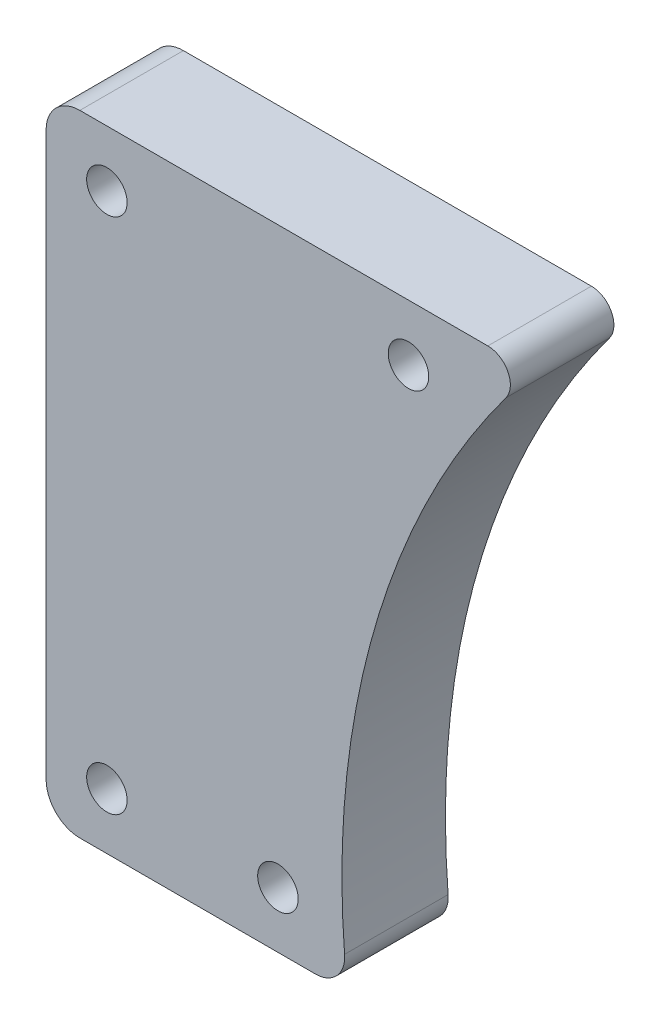
ISO-10303-21;
HEADER;
FILE_DESCRIPTION(('STEP AP214'),'2;1');
FILE_NAME('part.step','',(''),(''),'','','');
FILE_SCHEMA(('AUTOMOTIVE_DESIGN { 1 0 10303 214 1 1 1 1 }'));
ENDSEC;
DATA;
#1=APPLICATION_CONTEXT('core data for automotive mechanical design processes');
#2=APPLICATION_PROTOCOL_DEFINITION('international standard','automotive_design',2000,#1);
#3=PRODUCT_CONTEXT('',#1,'mechanical');
#4=PRODUCT('Part','Part','',(#3));
#5=PRODUCT_RELATED_PRODUCT_CATEGORY('part','',(#4));
#6=PRODUCT_DEFINITION_FORMATION('','',#4);
#7=PRODUCT_DEFINITION_CONTEXT('part definition',#1,'design');
#8=PRODUCT_DEFINITION('design','',#6,#7);
#9=PRODUCT_DEFINITION_SHAPE('','',#8);
#10=(LENGTH_UNIT() NAMED_UNIT(*) SI_UNIT(.MILLI.,.METRE.));
#11=(NAMED_UNIT(*) PLANE_ANGLE_UNIT() SI_UNIT($,.RADIAN.));
#12=(NAMED_UNIT(*) SI_UNIT($,.STERADIAN.) SOLID_ANGLE_UNIT());
#13=UNCERTAINTY_MEASURE_WITH_UNIT(LENGTH_MEASURE(1.E-05),#10,'distance_accuracy_value','');
#14=(GEOMETRIC_REPRESENTATION_CONTEXT(3) GLOBAL_UNCERTAINTY_ASSIGNED_CONTEXT((#13)) GLOBAL_UNIT_ASSIGNED_CONTEXT((#10,
#11,#12)) REPRESENTATION_CONTEXT('',''));
#15=CARTESIAN_POINT('',(0.,0.,0.));
#16=DIRECTION('',(0.,0.,1.));
#17=DIRECTION('',(1.,0.,0.));
#18=AXIS2_PLACEMENT_3D('',#15,#16,#17);
#19=CARTESIAN_POINT('',(99.822,0.,159.258));
#20=DIRECTION('',(0.,0.,-1.));
#21=DIRECTION('',(1.,0.,0.));
#22=AXIS2_PLACEMENT_3D('',#19,#20,#21);
#23=CYLINDRICAL_SURFACE('',#22,46.99);
#24=CARTESIAN_POINT('',(99.822,0.,159.258));
#25=DIRECTION('',(0.,0.,1.));
#26=DIRECTION('',(-1.,0.,0.));
#27=AXIS2_PLACEMENT_3D('',#24,#25,#26);
#28=CIRCLE('',#27,46.99);
#29=CARTESIAN_POINT('',(62.0869585035923,28.0022631811142,159.258));
#30=VERTEX_POINT('',#29);
#31=CARTESIAN_POINT('',(52.9817297942535,-3.74822452004331,159.258));
#32=VERTEX_POINT('',#31);
#33=EDGE_CURVE('E134',#30,#32,#28,.T.);
#34=ORIENTED_EDGE('',*,*,#33,.T.);
#35=DIRECTION('',(0.,0.,-1.));
#36=VECTOR('',#35,1.);
#37=CARTESIAN_POINT('',(52.9817297942535,-3.74822452004331,159.258));
#38=LINE('',#37,#36);
#39=CARTESIAN_POINT('',(52.9817297942535,-3.74822452004331,153.416));
#40=VERTEX_POINT('',#39);
#41=EDGE_CURVE('E155',#40,#32,#38,.F.);
#42=ORIENTED_EDGE('',*,*,#41,.F.);
#43=CARTESIAN_POINT('',(99.822,0.,153.416));
#44=DIRECTION('',(0.,0.,1.));
#45=DIRECTION('',(-1.,0.,0.));
#46=AXIS2_PLACEMENT_3D('',#43,#44,#45);
#47=CIRCLE('',#46,46.99);
#48=CARTESIAN_POINT('',(62.0869585035923,28.0022631811142,153.416));
#49=VERTEX_POINT('',#48);
#50=EDGE_CURVE('E136',#49,#40,#47,.T.);
#51=ORIENTED_EDGE('',*,*,#50,.F.);
#52=DIRECTION('',(0.,0.,-1.));
#53=VECTOR('',#52,1.);
#54=CARTESIAN_POINT('',(62.0869585035923,28.0022631811142,159.258));
#55=LINE('',#54,#53);
#56=EDGE_CURVE('E160',#30,#49,#55,.T.);
#57=ORIENTED_EDGE('',*,*,#56,.F.);
#58=EDGE_LOOP('',(#34,#42,#51,#57));
#59=FACE_BOUND('',#58,.T.);
#60=ADVANCED_FACE('F39',(#59),#23,.F.);
#61=CARTESIAN_POINT('',(36.1406413963146,-5.53091889507186,159.258));
#62=DIRECTION('',(0.,1.,0.));
#63=DIRECTION('',(1.,0.,0.));
#64=AXIS2_PLACEMENT_3D('',#61,#62,#63);
#65=PLANE('',#64);
#66=DIRECTION('',(-1.,0.,0.));
#67=VECTOR('',#66,1.);
#68=CARTESIAN_POINT('',(36.1406413963146,-5.53091889507186,159.258));
#69=LINE('',#68,#67);
#70=CARTESIAN_POINT('',(51.3359905708083,-5.53091889507186,159.258));
#71=VERTEX_POINT('',#70);
#72=CARTESIAN_POINT('',(38.0456413963146,-5.53091889507186,159.258));
#73=VERTEX_POINT('',#72);
#74=EDGE_CURVE('E184',#71,#73,#69,.T.);
#75=ORIENTED_EDGE('',*,*,#74,.T.);
#76=DIRECTION('',(0.,0.,-1.));
#77=VECTOR('',#76,1.);
#78=CARTESIAN_POINT('',(38.0456413963146,-5.53091889507186,159.258));
#79=LINE('',#78,#77);
#80=CARTESIAN_POINT('',(38.0456413963146,-5.53091889507186,153.416));
#81=VERTEX_POINT('',#80);
#82=EDGE_CURVE('E117',#81,#73,#79,.F.);
#83=ORIENTED_EDGE('',*,*,#82,.F.);
#84=DIRECTION('',(-1.,0.,0.));
#85=VECTOR('',#84,1.);
#86=CARTESIAN_POINT('',(36.1406413963146,-5.53091889507186,153.416));
#87=LINE('',#86,#85);
#88=CARTESIAN_POINT('',(51.3359905708083,-5.53091889507186,153.416));
#89=VERTEX_POINT('',#88);
#90=EDGE_CURVE('E113',#89,#81,#87,.T.);
#91=ORIENTED_EDGE('',*,*,#90,.F.);
#92=DIRECTION('',(0.,0.,-1.));
#93=VECTOR('',#92,1.);
#94=CARTESIAN_POINT('',(51.3359905708083,-5.53091889507186,159.258));
#95=LINE('',#94,#93);
#96=EDGE_CURVE('E150',#71,#89,#95,.T.);
#97=ORIENTED_EDGE('',*,*,#96,.F.);
#98=EDGE_LOOP('',(#75,#83,#91,#97));
#99=FACE_BOUND('',#98,.T.);
#100=ADVANCED_FACE('F222',(#99),#65,.F.);
#101=CARTESIAN_POINT('',(36.1406413963146,30.0290811049281,159.258));
#102=DIRECTION('',(1.,0.,0.));
#103=DIRECTION('',(0.,-1.,0.));
#104=AXIS2_PLACEMENT_3D('',#101,#102,#103);
#105=PLANE('',#104);
#106=DIRECTION('',(0.,1.,0.));
#107=VECTOR('',#106,1.);
#108=CARTESIAN_POINT('',(36.1406413963146,30.0290811049281,159.258));
#109=LINE('',#108,#107);
#110=CARTESIAN_POINT('',(36.1406413963146,-3.62591889507186,159.258));
#111=VERTEX_POINT('',#110);
#112=CARTESIAN_POINT('',(36.1406413963146,28.1240811049281,159.258));
#113=VERTEX_POINT('',#112);
#114=EDGE_CURVE('E182',#111,#113,#109,.T.);
#115=ORIENTED_EDGE('',*,*,#114,.T.);
#116=DIRECTION('',(0.,0.,-1.));
#117=VECTOR('',#116,1.);
#118=CARTESIAN_POINT('',(36.1406413963146,28.1240811049281,159.258));
#119=LINE('',#118,#117);
#120=CARTESIAN_POINT('',(36.1406413963146,28.1240811049281,153.416));
#121=VERTEX_POINT('',#120);
#122=EDGE_CURVE('E127',#121,#113,#119,.F.);
#123=ORIENTED_EDGE('',*,*,#122,.F.);
#124=DIRECTION('',(0.,1.,0.));
#125=VECTOR('',#124,1.);
#126=CARTESIAN_POINT('',(36.1406413963146,30.0290811049281,153.416));
#127=LINE('',#126,#125);
#128=CARTESIAN_POINT('',(36.1406413963146,-3.62591889507186,153.416));
#129=VERTEX_POINT('',#128);
#130=EDGE_CURVE('E110',#129,#121,#127,.T.);
#131=ORIENTED_EDGE('',*,*,#130,.F.);
#132=DIRECTION('',(0.,0.,-1.));
#133=VECTOR('',#132,1.);
#134=CARTESIAN_POINT('',(36.1406413963146,-3.62591889507186,159.258));
#135=LINE('',#134,#133);
#136=EDGE_CURVE('E121',#111,#129,#135,.T.);
#137=ORIENTED_EDGE('',*,*,#136,.F.);
#138=EDGE_LOOP('',(#115,#123,#131,#137));
#139=FACE_BOUND('',#138,.T.);
#140=ADVANCED_FACE('F129',(#139),#105,.F.);
#141=CARTESIAN_POINT('',(63.6790285118441,30.0290811049281,159.258));
#142=DIRECTION('',(0.,-1.,0.));
#143=DIRECTION('',(0.,0.,-1.));
#144=AXIS2_PLACEMENT_3D('',#141,#142,#143);
#145=PLANE('',#144);
#146=DIRECTION('',(1.,0.,0.));
#147=VECTOR('',#146,1.);
#148=CARTESIAN_POINT('',(63.6790285118441,30.0290811049281,153.416));
#149=LINE('',#148,#147);
#150=CARTESIAN_POINT('',(38.0456413963146,30.0290811049281,153.416));
#151=VERTEX_POINT('',#150);
#152=CARTESIAN_POINT('',(61.0670925172029,30.0290811049281,153.416));
#153=VERTEX_POINT('',#152);
#154=EDGE_CURVE('E131',#151,#153,#149,.T.);
#155=ORIENTED_EDGE('',*,*,#154,.F.);
#156=DIRECTION('',(0.,0.,-1.));
#157=VECTOR('',#156,1.);
#158=CARTESIAN_POINT('',(38.0456413963146,30.0290811049281,159.258));
#159=LINE('',#158,#157);
#160=CARTESIAN_POINT('',(38.0456413963146,30.0290811049281,159.258));
#161=VERTEX_POINT('',#160);
#162=EDGE_CURVE('E147',#161,#151,#159,.T.);
#163=ORIENTED_EDGE('',*,*,#162,.F.);
#164=DIRECTION('',(1.,0.,0.));
#165=VECTOR('',#164,1.);
#166=CARTESIAN_POINT('',(63.6790285118441,30.0290811049281,159.258));
#167=LINE('',#166,#165);
#168=CARTESIAN_POINT('',(61.0670925172029,30.0290811049281,159.258));
#169=VERTEX_POINT('',#168);
#170=EDGE_CURVE('E140',#161,#169,#167,.T.);
#171=ORIENTED_EDGE('',*,*,#170,.T.);
#172=DIRECTION('',(0.,0.,-1.));
#173=VECTOR('',#172,1.);
#174=CARTESIAN_POINT('',(61.0670925172029,30.0290811049281,159.258));
#175=LINE('',#174,#173);
#176=EDGE_CURVE('E48',#153,#169,#175,.F.);
#177=ORIENTED_EDGE('',*,*,#176,.F.);
#178=EDGE_LOOP('',(#155,#163,#171,#177));
#179=FACE_BOUND('',#178,.T.);
#180=ADVANCED_FACE('F207',(#179),#145,.F.);
#181=CARTESIAN_POINT('',(99.822,0.,159.258));
#182=DIRECTION('',(0.,0.,1.));
#183=DIRECTION('',(-1.,0.,0.));
#184=AXIS2_PLACEMENT_3D('',#181,#182,#183);
#185=PLANE('',#184);
#186=CARTESIAN_POINT('',(39.5696413963146,-2.35591889507186,159.258));
#187=DIRECTION('',(0.,0.,1.));
#188=DIRECTION('',(-1.,0.,0.));
#189=AXIS2_PLACEMENT_3D('',#186,#187,#188);
#190=CIRCLE('',#189,1.143);
#191=CARTESIAN_POINT('',(40.7126413963146,-2.35591889507186,159.258));
#192=VERTEX_POINT('',#191);
#193=EDGE_CURVE('E168',#192,#192,#190,.T.);
#194=ORIENTED_EDGE('',*,*,#193,.F.);
#195=EDGE_LOOP('',(#194));
#196=FACE_BOUND('',#195,.T.);
#197=CARTESIAN_POINT('',(49.2216413963146,-2.35591889507186,159.258));
#198=DIRECTION('',(0.,0.,1.));
#199=DIRECTION('',(-1.,0.,0.));
#200=AXIS2_PLACEMENT_3D('',#197,#198,#199);
#201=CIRCLE('',#200,1.143);
#202=CARTESIAN_POINT('',(50.3646413963146,-2.35591889507186,159.258));
#203=VERTEX_POINT('',#202);
#204=EDGE_CURVE('E195',#203,#203,#201,.T.);
#205=ORIENTED_EDGE('',*,*,#204,.F.);
#206=EDGE_LOOP('',(#205));
#207=FACE_BOUND('',#206,.T.);
#208=CARTESIAN_POINT('',(39.5696413963146,26.8540811049281,159.258));
#209=DIRECTION('',(0.,0.,1.));
#210=DIRECTION('',(-1.,0.,0.));
#211=AXIS2_PLACEMENT_3D('',#208,#209,#210);
#212=CIRCLE('',#211,1.143);
#213=CARTESIAN_POINT('',(40.7126413963146,26.8540811049281,159.258));
#214=VERTEX_POINT('',#213);
#215=EDGE_CURVE('E192',#214,#214,#212,.T.);
#216=ORIENTED_EDGE('',*,*,#215,.F.);
#217=EDGE_LOOP('',(#216));
#218=FACE_BOUND('',#217,.T.);
#219=CARTESIAN_POINT('',(56.5876413963146,26.8540811049281,159.258));
#220=DIRECTION('',(0.,0.,1.));
#221=DIRECTION('',(-1.,0.,0.));
#222=AXIS2_PLACEMENT_3D('',#219,#220,#221);
#223=CIRCLE('',#222,1.143);
#224=CARTESIAN_POINT('',(57.7306413963146,26.8540811049281,159.258));
#225=VERTEX_POINT('',#224);
#226=EDGE_CURVE('E189',#225,#225,#223,.T.);
#227=ORIENTED_EDGE('',*,*,#226,.F.);
#228=EDGE_LOOP('',(#227));
#229=FACE_BOUND('',#228,.T.);
#230=ORIENTED_EDGE('',*,*,#170,.F.);
#231=CARTESIAN_POINT('',(38.0456413963146,28.1240811049281,159.258));
#232=DIRECTION('',(0.,0.,-1.));
#233=DIRECTION('',(-1.,0.,0.));
#234=AXIS2_PLACEMENT_3D('',#231,#232,#233);
#235=CIRCLE('',#234,1.905);
#236=EDGE_CURVE('E144',#113,#161,#235,.T.);
#237=ORIENTED_EDGE('',*,*,#236,.F.);
#238=ORIENTED_EDGE('',*,*,#114,.F.);
#239=CARTESIAN_POINT('',(38.0456413963146,-3.62591889507186,159.258));
#240=DIRECTION('',(0.,0.,-1.));
#241=DIRECTION('',(-1.,0.,0.));
#242=AXIS2_PLACEMENT_3D('',#239,#240,#241);
#243=CIRCLE('',#242,1.905);
#244=EDGE_CURVE('E123',#73,#111,#243,.T.);
#245=ORIENTED_EDGE('',*,*,#244,.F.);
#246=ORIENTED_EDGE('',*,*,#74,.F.);
#247=CARTESIAN_POINT('',(51.3359905708083,-3.87991889507186,159.258));
#248=DIRECTION('',(0.,0.,-1.));
#249=DIRECTION('',(-1.,0.,0.));
#250=AXIS2_PLACEMENT_3D('',#247,#248,#249);
#251=CIRCLE('',#250,1.651);
#252=EDGE_CURVE('E158',#32,#71,#251,.T.);
#253=ORIENTED_EDGE('',*,*,#252,.F.);
#254=ORIENTED_EDGE('',*,*,#33,.F.);
#255=CARTESIAN_POINT('',(61.0670925172029,28.7590811049281,159.258));
#256=DIRECTION('',(0.,0.,-1.));
#257=DIRECTION('',(-1.,0.,0.));
#258=AXIS2_PLACEMENT_3D('',#255,#256,#257);
#259=CIRCLE('',#258,1.27);
#260=EDGE_CURVE('E11',#169,#30,#259,.T.);
#261=ORIENTED_EDGE('',*,*,#260,.F.);
#262=EDGE_LOOP('',(#230,#237,#238,#245,#246,#253,#254,#261));
#263=FACE_BOUND('',#262,.T.);
#264=ADVANCED_FACE('F204',(#196,#207,#218,#229,#263),#185,.T.);
#265=CARTESIAN_POINT('',(99.822,0.,153.416));
#266=DIRECTION('',(0.,0.,1.));
#267=DIRECTION('',(-1.,0.,0.));
#268=AXIS2_PLACEMENT_3D('',#265,#266,#267);
#269=PLANE('',#268);
#270=CARTESIAN_POINT('',(39.5696413963146,-2.35591889507186,153.416));
#271=DIRECTION('',(0.,0.,1.));
#272=DIRECTION('',(1.,0.,0.));
#273=AXIS2_PLACEMENT_3D('',#270,#271,#272);
#274=CIRCLE('',#273,1.143);
#275=CARTESIAN_POINT('',(40.7126413963146,-2.35591889507186,153.416));
#276=VERTEX_POINT('',#275);
#277=EDGE_CURVE('E43',#276,#276,#274,.T.);
#278=ORIENTED_EDGE('',*,*,#277,.T.);
#279=EDGE_LOOP('',(#278));
#280=FACE_BOUND('',#279,.T.);
#281=CARTESIAN_POINT('',(49.2216413963146,-2.35591889507186,153.416));
#282=DIRECTION('',(0.,0.,1.));
#283=DIRECTION('',(1.,0.,0.));
#284=AXIS2_PLACEMENT_3D('',#281,#282,#283);
#285=CIRCLE('',#284,1.143);
#286=CARTESIAN_POINT('',(50.3646413963146,-2.35591889507186,153.416));
#287=VERTEX_POINT('',#286);
#288=EDGE_CURVE('E170',#287,#287,#285,.T.);
#289=ORIENTED_EDGE('',*,*,#288,.T.);
#290=EDGE_LOOP('',(#289));
#291=FACE_BOUND('',#290,.T.);
#292=CARTESIAN_POINT('',(39.5696413963146,26.8540811049281,153.416));
#293=DIRECTION('',(0.,0.,1.));
#294=DIRECTION('',(1.,0.,0.));
#295=AXIS2_PLACEMENT_3D('',#292,#293,#294);
#296=CIRCLE('',#295,1.143);
#297=CARTESIAN_POINT('',(40.7126413963146,26.8540811049281,153.416));
#298=VERTEX_POINT('',#297);
#299=EDGE_CURVE('E167',#298,#298,#296,.T.);
#300=ORIENTED_EDGE('',*,*,#299,.T.);
#301=EDGE_LOOP('',(#300));
#302=FACE_BOUND('',#301,.T.);
#303=CARTESIAN_POINT('',(56.5876413963146,26.8540811049281,153.416));
#304=DIRECTION('',(0.,0.,1.));
#305=DIRECTION('',(1.,0.,0.));
#306=AXIS2_PLACEMENT_3D('',#303,#304,#305);
#307=CIRCLE('',#306,1.143);
#308=CARTESIAN_POINT('',(57.7306413963146,26.8540811049281,153.416));
#309=VERTEX_POINT('',#308);
#310=EDGE_CURVE('E164',#309,#309,#307,.T.);
#311=ORIENTED_EDGE('',*,*,#310,.T.);
#312=EDGE_LOOP('',(#311));
#313=FACE_BOUND('',#312,.T.);
#314=ORIENTED_EDGE('',*,*,#50,.T.);
#315=CARTESIAN_POINT('',(51.3359905708083,-3.87991889507186,153.416));
#316=DIRECTION('',(0.,0.,-1.));
#317=DIRECTION('',(-1.,0.,0.));
#318=AXIS2_PLACEMENT_3D('',#315,#316,#317);
#319=CIRCLE('',#318,1.651);
#320=EDGE_CURVE('E153',#89,#40,#319,.F.);
#321=ORIENTED_EDGE('',*,*,#320,.F.);
#322=ORIENTED_EDGE('',*,*,#90,.T.);
#323=CARTESIAN_POINT('',(38.0456413963146,-3.62591889507186,153.416));
#324=DIRECTION('',(0.,0.,-1.));
#325=DIRECTION('',(-1.,0.,0.));
#326=AXIS2_PLACEMENT_3D('',#323,#324,#325);
#327=CIRCLE('',#326,1.905);
#328=EDGE_CURVE('E105',#129,#81,#327,.F.);
#329=ORIENTED_EDGE('',*,*,#328,.F.);
#330=ORIENTED_EDGE('',*,*,#130,.T.);
#331=CARTESIAN_POINT('',(38.0456413963146,28.1240811049281,153.416));
#332=DIRECTION('',(0.,0.,-1.));
#333=DIRECTION('',(-1.,0.,0.));
#334=AXIS2_PLACEMENT_3D('',#331,#332,#333);
#335=CIRCLE('',#334,1.905);
#336=EDGE_CURVE('E118',#151,#121,#335,.F.);
#337=ORIENTED_EDGE('',*,*,#336,.F.);
#338=ORIENTED_EDGE('',*,*,#154,.T.);
#339=CARTESIAN_POINT('',(61.0670925172029,28.7590811049281,153.416));
#340=DIRECTION('',(0.,0.,-1.));
#341=DIRECTION('',(-1.,0.,0.));
#342=AXIS2_PLACEMENT_3D('',#339,#340,#341);
#343=CIRCLE('',#342,1.27);
#344=EDGE_CURVE('E61',#49,#153,#343,.F.);
#345=ORIENTED_EDGE('',*,*,#344,.F.);
#346=EDGE_LOOP('',(#314,#321,#322,#329,#330,#337,#338,#345));
#347=FACE_BOUND('',#346,.T.);
#348=ADVANCED_FACE('F108',(#280,#291,#302,#313,#347),#269,.F.);
#349=CARTESIAN_POINT('',(38.0456413963146,-3.62591889507186,159.258));
#350=DIRECTION('',(0.,0.,-1.));
#351=DIRECTION('',(1.,0.,0.));
#352=AXIS2_PLACEMENT_3D('',#349,#350,#351);
#353=CYLINDRICAL_SURFACE('',#352,1.905);
#354=ORIENTED_EDGE('',*,*,#244,.T.);
#355=ORIENTED_EDGE('',*,*,#136,.T.);
#356=ORIENTED_EDGE('',*,*,#328,.T.);
#357=ORIENTED_EDGE('',*,*,#82,.T.);
#358=EDGE_LOOP('',(#354,#355,#356,#357));
#359=FACE_BOUND('',#358,.T.);
#360=ADVANCED_FACE('F122',(#359),#353,.T.);
#361=CARTESIAN_POINT('',(38.0456413963146,28.1240811049281,159.258));
#362=DIRECTION('',(0.,0.,-1.));
#363=DIRECTION('',(1.,0.,0.));
#364=AXIS2_PLACEMENT_3D('',#361,#362,#363);
#365=CYLINDRICAL_SURFACE('',#364,1.905);
#366=ORIENTED_EDGE('',*,*,#236,.T.);
#367=ORIENTED_EDGE('',*,*,#162,.T.);
#368=ORIENTED_EDGE('',*,*,#336,.T.);
#369=ORIENTED_EDGE('',*,*,#122,.T.);
#370=EDGE_LOOP('',(#366,#367,#368,#369));
#371=FACE_BOUND('',#370,.T.);
#372=ADVANCED_FACE('F218',(#371),#365,.T.);
#373=CARTESIAN_POINT('',(51.3359905708083,-3.87991889507186,159.258));
#374=DIRECTION('',(0.,0.,-1.));
#375=DIRECTION('',(1.,0.,0.));
#376=AXIS2_PLACEMENT_3D('',#373,#374,#375);
#377=CYLINDRICAL_SURFACE('',#376,1.651);
#378=ORIENTED_EDGE('',*,*,#252,.T.);
#379=ORIENTED_EDGE('',*,*,#96,.T.);
#380=ORIENTED_EDGE('',*,*,#320,.T.);
#381=ORIENTED_EDGE('',*,*,#41,.T.);
#382=EDGE_LOOP('',(#378,#379,#380,#381));
#383=FACE_BOUND('',#382,.T.);
#384=ADVANCED_FACE('F224',(#383),#377,.T.);
#385=CARTESIAN_POINT('',(61.0670925172029,28.7590811049281,159.258));
#386=DIRECTION('',(0.,0.,-1.));
#387=DIRECTION('',(1.,0.,0.));
#388=AXIS2_PLACEMENT_3D('',#385,#386,#387);
#389=CYLINDRICAL_SURFACE('',#388,1.27);
#390=ORIENTED_EDGE('',*,*,#260,.T.);
#391=ORIENTED_EDGE('',*,*,#56,.T.);
#392=ORIENTED_EDGE('',*,*,#344,.T.);
#393=ORIENTED_EDGE('',*,*,#176,.T.);
#394=EDGE_LOOP('',(#390,#391,#392,#393));
#395=FACE_BOUND('',#394,.T.);
#396=ADVANCED_FACE('F41',(#395),#389,.T.);
#397=CARTESIAN_POINT('',(56.5876413963146,26.8540811049281,143.833107796415));
#398=DIRECTION('',(0.,0.,1.));
#399=DIRECTION('',(1.,0.,0.));
#400=AXIS2_PLACEMENT_3D('',#397,#398,#399);
#401=CYLINDRICAL_SURFACE('',#400,1.143);
#402=CARTESIAN_POINT('',(57.7306413963146,26.8540811049281,159.258));
#403=CARTESIAN_POINT('',(57.7306413963146,26.8540811049281,159.197145833333));
#404=CARTESIAN_POINT('',(57.7306413963146,26.8540811049281,159.136291666667));
#405=CARTESIAN_POINT('',(57.7306413963146,26.8540811049281,159.014583333333));
#406=CARTESIAN_POINT('',(57.7306413963146,26.8540811049281,158.953729166667));
#407=CARTESIAN_POINT('',(57.7306413963146,26.8540811049281,158.832020833333));
#408=CARTESIAN_POINT('',(57.7306413963146,26.8540811049281,158.771166666667));
#409=CARTESIAN_POINT('',(57.7306413963146,26.8540811049281,158.649458333333));
#410=CARTESIAN_POINT('',(57.7306413963146,26.8540811049281,158.588604166667));
#411=CARTESIAN_POINT('',(57.7306413963146,26.8540811049281,158.466895833333));
#412=CARTESIAN_POINT('',(57.7306413963146,26.8540811049281,158.406041666667));
#413=CARTESIAN_POINT('',(57.7306413963146,26.8540811049281,158.284333333333));
#414=CARTESIAN_POINT('',(57.7306413963146,26.8540811049281,158.223479166667));
#415=CARTESIAN_POINT('',(57.7306413963146,26.8540811049281,158.101770833333));
#416=CARTESIAN_POINT('',(57.7306413963146,26.8540811049281,158.040916666667));
#417=CARTESIAN_POINT('',(57.7306413963146,26.8540811049281,157.919208333333));
#418=CARTESIAN_POINT('',(57.7306413963146,26.8540811049281,157.858354166667));
#419=CARTESIAN_POINT('',(57.7306413963146,26.8540811049281,157.736645833333));
#420=CARTESIAN_POINT('',(57.7306413963146,26.8540811049281,157.675791666667));
#421=CARTESIAN_POINT('',(57.7306413963146,26.8540811049281,157.554083333333));
#422=CARTESIAN_POINT('',(57.7306413963146,26.8540811049281,157.493229166667));
#423=CARTESIAN_POINT('',(57.7306413963146,26.8540811049281,157.371520833333));
#424=CARTESIAN_POINT('',(57.7306413963146,26.8540811049281,157.310666666667));
#425=CARTESIAN_POINT('',(57.7306413963146,26.8540811049281,157.188958333333));
#426=CARTESIAN_POINT('',(57.7306413963146,26.8540811049281,157.128104166667));
#427=CARTESIAN_POINT('',(57.7306413963146,26.8540811049281,157.006395833333));
#428=CARTESIAN_POINT('',(57.7306413963146,26.8540811049281,156.945541666667));
#429=CARTESIAN_POINT('',(57.7306413963146,26.8540811049281,156.823833333333));
#430=CARTESIAN_POINT('',(57.7306413963146,26.8540811049281,156.762979166667));
#431=CARTESIAN_POINT('',(57.7306413963146,26.8540811049281,156.641270833333));
#432=CARTESIAN_POINT('',(57.7306413963146,26.8540811049281,156.580416666667));
#433=CARTESIAN_POINT('',(57.7306413963146,26.8540811049281,156.458708333333));
#434=CARTESIAN_POINT('',(57.7306413963146,26.8540811049281,156.397854166667));
#435=CARTESIAN_POINT('',(57.7306413963146,26.8540811049281,156.276145833333));
#436=CARTESIAN_POINT('',(57.7306413963146,26.8540811049281,156.215291666667));
#437=CARTESIAN_POINT('',(57.7306413963146,26.8540811049281,156.093583333333));
#438=CARTESIAN_POINT('',(57.7306413963146,26.8540811049281,156.032729166667));
#439=CARTESIAN_POINT('',(57.7306413963146,26.8540811049281,155.911020833333));
#440=CARTESIAN_POINT('',(57.7306413963146,26.8540811049281,155.850166666667));
#441=CARTESIAN_POINT('',(57.7306413963146,26.8540811049281,155.728458333333));
#442=CARTESIAN_POINT('',(57.7306413963146,26.8540811049281,155.667604166667));
#443=CARTESIAN_POINT('',(57.7306413963146,26.8540811049281,155.545895833333));
#444=CARTESIAN_POINT('',(57.7306413963146,26.8540811049281,155.485041666667));
#445=CARTESIAN_POINT('',(57.7306413963146,26.8540811049281,155.363333333333));
#446=CARTESIAN_POINT('',(57.7306413963146,26.8540811049281,155.302479166667));
#447=CARTESIAN_POINT('',(57.7306413963146,26.8540811049281,155.180770833333));
#448=CARTESIAN_POINT('',(57.7306413963146,26.8540811049281,155.119916666667));
#449=CARTESIAN_POINT('',(57.7306413963146,26.8540811049281,154.998208333333));
#450=CARTESIAN_POINT('',(57.7306413963146,26.8540811049281,154.937354166667));
#451=CARTESIAN_POINT('',(57.7306413963146,26.8540811049281,154.815645833333));
#452=CARTESIAN_POINT('',(57.7306413963146,26.8540811049281,154.754791666667));
#453=CARTESIAN_POINT('',(57.7306413963146,26.8540811049281,154.633083333333));
#454=CARTESIAN_POINT('',(57.7306413963146,26.8540811049281,154.572229166667));
#455=CARTESIAN_POINT('',(57.7306413963146,26.8540811049281,154.450520833333));
#456=CARTESIAN_POINT('',(57.7306413963146,26.8540811049281,154.389666666667));
#457=CARTESIAN_POINT('',(57.7306413963146,26.8540811049281,154.267958333333));
#458=CARTESIAN_POINT('',(57.7306413963146,26.8540811049281,154.207104166667));
#459=CARTESIAN_POINT('',(57.7306413963146,26.8540811049281,154.085395833333));
#460=CARTESIAN_POINT('',(57.7306413963146,26.8540811049281,154.024541666667));
#461=CARTESIAN_POINT('',(57.7306413963146,26.8540811049281,153.902833333333));
#462=CARTESIAN_POINT('',(57.7306413963146,26.8540811049281,153.841979166667));
#463=CARTESIAN_POINT('',(57.7306413963146,26.8540811049281,153.720270833333));
#464=CARTESIAN_POINT('',(57.7306413963146,26.8540811049281,153.659416666667));
#465=CARTESIAN_POINT('',(57.7306413963146,26.8540811049281,153.537708333333));
#466=CARTESIAN_POINT('',(57.7306413963146,26.8540811049281,153.476854166667));
#467=CARTESIAN_POINT('',(57.7306413963146,26.8540811049281,153.416));
#468=B_SPLINE_CURVE_WITH_KNOTS('',3,(#402,#403,#404,#405,#406,#407,#408,#409,#410,#411,#412,
#413,#414,#415,#416,#417,#418,#419,#420,#421,#422,#423,#424,#425,#426,#427,#428,#429,#430,#431,
#432,#433,#434,#435,#436,#437,#438,#439,#440,#441,#442,#443,#444,#445,#446,#447,#448,#449,#450,
#451,#452,#453,#454,#455,#456,#457,#458,#459,#460,#461,#462,#463,#464,#465,#466,#467),
.UNSPECIFIED.,.F.,.F.,(4,2,2,2,2,2,2,2,2,2,2,2,2,2,2,2,2,2,2,2,2,2,2,2,2,2,2,2,2,2,2,2,4),(0.,
0.182562499999983,0.365124999999994,0.547687499999977,0.730249999999988,0.912812499999999,
1.09537499999998,1.27793749999999,1.46049999999998,1.64306249999999,1.82562499999997,
2.00818749999998,2.19074999999999,2.37331249999997,2.55587499999999,2.73843749999997,
2.92099999999998,3.10356249999999,3.28612499999997,3.46868749999998,3.65124999999997,
3.83381249999998,4.01637499999999,4.19893749999997,4.38149999999998,4.56406249999997,
4.74662499999998,4.92918749999996,5.11174999999997,5.29431249999998,5.47687499999996,
5.65943749999998,5.84199999999996),.UNSPECIFIED.);
#469=EDGE_CURVE('BSEAM228',#225,#309,#468,.T.);
#470=ORIENTED_EDGE('',*,*,#226,.T.);
#471=ORIENTED_EDGE('',*,*,#310,.F.);
#472=ORIENTED_EDGE('',*,*,#469,.T.);
#473=ORIENTED_EDGE('',*,*,#469,.F.);
#474=EDGE_LOOP('',(#470,#472,#471,#473));
#475=FACE_BOUND('',#474,.T.);
#476=ADVANCED_FACE('F228',(#475),#401,.F.);
#477=CARTESIAN_POINT('',(39.5696413963146,26.8540811049281,143.833107796415));
#478=DIRECTION('',(0.,0.,1.));
#479=DIRECTION('',(1.,0.,0.));
#480=AXIS2_PLACEMENT_3D('',#477,#478,#479);
#481=CYLINDRICAL_SURFACE('',#480,1.143);
#482=CARTESIAN_POINT('',(40.7126413963146,26.8540811049281,159.258));
#483=CARTESIAN_POINT('',(40.7126413963146,26.8540811049281,159.197145833333));
#484=CARTESIAN_POINT('',(40.7126413963146,26.8540811049281,159.136291666667));
#485=CARTESIAN_POINT('',(40.7126413963146,26.8540811049281,159.014583333333));
#486=CARTESIAN_POINT('',(40.7126413963146,26.8540811049281,158.953729166667));
#487=CARTESIAN_POINT('',(40.7126413963146,26.8540811049281,158.832020833333));
#488=CARTESIAN_POINT('',(40.7126413963146,26.8540811049281,158.771166666667));
#489=CARTESIAN_POINT('',(40.7126413963146,26.8540811049281,158.649458333333));
#490=CARTESIAN_POINT('',(40.7126413963146,26.8540811049281,158.588604166667));
#491=CARTESIAN_POINT('',(40.7126413963146,26.8540811049281,158.466895833333));
#492=CARTESIAN_POINT('',(40.7126413963146,26.8540811049281,158.406041666667));
#493=CARTESIAN_POINT('',(40.7126413963146,26.8540811049281,158.284333333333));
#494=CARTESIAN_POINT('',(40.7126413963146,26.8540811049281,158.223479166667));
#495=CARTESIAN_POINT('',(40.7126413963146,26.8540811049281,158.101770833333));
#496=CARTESIAN_POINT('',(40.7126413963146,26.8540811049281,158.040916666667));
#497=CARTESIAN_POINT('',(40.7126413963146,26.8540811049281,157.919208333333));
#498=CARTESIAN_POINT('',(40.7126413963146,26.8540811049281,157.858354166667));
#499=CARTESIAN_POINT('',(40.7126413963146,26.8540811049281,157.736645833333));
#500=CARTESIAN_POINT('',(40.7126413963146,26.8540811049281,157.675791666667));
#501=CARTESIAN_POINT('',(40.7126413963146,26.8540811049281,157.554083333333));
#502=CARTESIAN_POINT('',(40.7126413963146,26.8540811049281,157.493229166667));
#503=CARTESIAN_POINT('',(40.7126413963146,26.8540811049281,157.371520833333));
#504=CARTESIAN_POINT('',(40.7126413963146,26.8540811049281,157.310666666667));
#505=CARTESIAN_POINT('',(40.7126413963146,26.8540811049281,157.188958333333));
#506=CARTESIAN_POINT('',(40.7126413963146,26.8540811049281,157.128104166667));
#507=CARTESIAN_POINT('',(40.7126413963146,26.8540811049281,157.006395833333));
#508=CARTESIAN_POINT('',(40.7126413963146,26.8540811049281,156.945541666667));
#509=CARTESIAN_POINT('',(40.7126413963146,26.8540811049281,156.823833333333));
#510=CARTESIAN_POINT('',(40.7126413963146,26.8540811049281,156.762979166667));
#511=CARTESIAN_POINT('',(40.7126413963146,26.8540811049281,156.641270833333));
#512=CARTESIAN_POINT('',(40.7126413963146,26.8540811049281,156.580416666667));
#513=CARTESIAN_POINT('',(40.7126413963146,26.8540811049281,156.458708333333));
#514=CARTESIAN_POINT('',(40.7126413963146,26.8540811049281,156.397854166667));
#515=CARTESIAN_POINT('',(40.7126413963146,26.8540811049281,156.276145833333));
#516=CARTESIAN_POINT('',(40.7126413963146,26.8540811049281,156.215291666667));
#517=CARTESIAN_POINT('',(40.7126413963146,26.8540811049281,156.093583333333));
#518=CARTESIAN_POINT('',(40.7126413963146,26.8540811049281,156.032729166667));
#519=CARTESIAN_POINT('',(40.7126413963146,26.8540811049281,155.911020833333));
#520=CARTESIAN_POINT('',(40.7126413963146,26.8540811049281,155.850166666667));
#521=CARTESIAN_POINT('',(40.7126413963146,26.8540811049281,155.728458333333));
#522=CARTESIAN_POINT('',(40.7126413963146,26.8540811049281,155.667604166667));
#523=CARTESIAN_POINT('',(40.7126413963146,26.8540811049281,155.545895833333));
#524=CARTESIAN_POINT('',(40.7126413963146,26.8540811049281,155.485041666667));
#525=CARTESIAN_POINT('',(40.7126413963146,26.8540811049281,155.363333333333));
#526=CARTESIAN_POINT('',(40.7126413963146,26.8540811049281,155.302479166667));
#527=CARTESIAN_POINT('',(40.7126413963146,26.8540811049281,155.180770833333));
#528=CARTESIAN_POINT('',(40.7126413963146,26.8540811049281,155.119916666667));
#529=CARTESIAN_POINT('',(40.7126413963146,26.8540811049281,154.998208333333));
#530=CARTESIAN_POINT('',(40.7126413963146,26.8540811049281,154.937354166667));
#531=CARTESIAN_POINT('',(40.7126413963146,26.8540811049281,154.815645833333));
#532=CARTESIAN_POINT('',(40.7126413963146,26.8540811049281,154.754791666667));
#533=CARTESIAN_POINT('',(40.7126413963146,26.8540811049281,154.633083333333));
#534=CARTESIAN_POINT('',(40.7126413963146,26.8540811049281,154.572229166667));
#535=CARTESIAN_POINT('',(40.7126413963146,26.8540811049281,154.450520833333));
#536=CARTESIAN_POINT('',(40.7126413963146,26.8540811049281,154.389666666667));
#537=CARTESIAN_POINT('',(40.7126413963146,26.8540811049281,154.267958333333));
#538=CARTESIAN_POINT('',(40.7126413963146,26.8540811049281,154.207104166667));
#539=CARTESIAN_POINT('',(40.7126413963146,26.8540811049281,154.085395833333));
#540=CARTESIAN_POINT('',(40.7126413963146,26.8540811049281,154.024541666667));
#541=CARTESIAN_POINT('',(40.7126413963146,26.8540811049281,153.902833333333));
#542=CARTESIAN_POINT('',(40.7126413963146,26.8540811049281,153.841979166667));
#543=CARTESIAN_POINT('',(40.7126413963146,26.8540811049281,153.720270833333));
#544=CARTESIAN_POINT('',(40.7126413963146,26.8540811049281,153.659416666667));
#545=CARTESIAN_POINT('',(40.7126413963146,26.8540811049281,153.537708333333));
#546=CARTESIAN_POINT('',(40.7126413963146,26.8540811049281,153.476854166667));
#547=CARTESIAN_POINT('',(40.7126413963146,26.8540811049281,153.416));
#548=B_SPLINE_CURVE_WITH_KNOTS('',3,(#482,#483,#484,#485,#486,#487,#488,#489,#490,#491,#492,
#493,#494,#495,#496,#497,#498,#499,#500,#501,#502,#503,#504,#505,#506,#507,#508,#509,#510,#511,
#512,#513,#514,#515,#516,#517,#518,#519,#520,#521,#522,#523,#524,#525,#526,#527,#528,#529,#530,
#531,#532,#533,#534,#535,#536,#537,#538,#539,#540,#541,#542,#543,#544,#545,#546,#547),
.UNSPECIFIED.,.F.,.F.,(4,2,2,2,2,2,2,2,2,2,2,2,2,2,2,2,2,2,2,2,2,2,2,2,2,2,2,2,2,2,2,2,4),(0.,
0.182562499999983,0.365124999999994,0.547687499999977,0.730249999999988,0.912812499999999,
1.09537499999998,1.27793749999999,1.46049999999998,1.64306249999999,1.82562499999997,
2.00818749999998,2.19074999999999,2.37331249999997,2.55587499999999,2.73843749999997,
2.92099999999998,3.10356249999999,3.28612499999997,3.46868749999998,3.65124999999997,
3.83381249999998,4.01637499999999,4.19893749999997,4.38149999999998,4.56406249999997,
4.74662499999998,4.92918749999996,5.11174999999997,5.29431249999998,5.47687499999996,
5.65943749999998,5.84199999999996),.UNSPECIFIED.);
#549=EDGE_CURVE('BSEAM234',#214,#298,#548,.T.);
#550=ORIENTED_EDGE('',*,*,#215,.T.);
#551=ORIENTED_EDGE('',*,*,#299,.F.);
#552=ORIENTED_EDGE('',*,*,#549,.T.);
#553=ORIENTED_EDGE('',*,*,#549,.F.);
#554=EDGE_LOOP('',(#550,#552,#551,#553));
#555=FACE_BOUND('',#554,.T.);
#556=ADVANCED_FACE('F234',(#555),#481,.F.);
#557=CARTESIAN_POINT('',(49.2216413963146,-2.35591889507186,143.833107796415));
#558=DIRECTION('',(0.,0.,1.));
#559=DIRECTION('',(1.,0.,0.));
#560=AXIS2_PLACEMENT_3D('',#557,#558,#559);
#561=CYLINDRICAL_SURFACE('',#560,1.143);
#562=CARTESIAN_POINT('',(50.3646413963146,-2.35591889507186,159.258));
#563=CARTESIAN_POINT('',(50.3646413963146,-2.35591889507186,159.197145833333));
#564=CARTESIAN_POINT('',(50.3646413963146,-2.35591889507186,159.136291666667));
#565=CARTESIAN_POINT('',(50.3646413963146,-2.35591889507186,159.014583333333));
#566=CARTESIAN_POINT('',(50.3646413963146,-2.35591889507186,158.953729166667));
#567=CARTESIAN_POINT('',(50.3646413963146,-2.35591889507186,158.832020833333));
#568=CARTESIAN_POINT('',(50.3646413963146,-2.35591889507186,158.771166666667));
#569=CARTESIAN_POINT('',(50.3646413963146,-2.35591889507186,158.649458333333));
#570=CARTESIAN_POINT('',(50.3646413963146,-2.35591889507186,158.588604166667));
#571=CARTESIAN_POINT('',(50.3646413963146,-2.35591889507186,158.466895833333));
#572=CARTESIAN_POINT('',(50.3646413963146,-2.35591889507186,158.406041666667));
#573=CARTESIAN_POINT('',(50.3646413963146,-2.35591889507186,158.284333333333));
#574=CARTESIAN_POINT('',(50.3646413963146,-2.35591889507186,158.223479166667));
#575=CARTESIAN_POINT('',(50.3646413963146,-2.35591889507186,158.101770833333));
#576=CARTESIAN_POINT('',(50.3646413963146,-2.35591889507186,158.040916666667));
#577=CARTESIAN_POINT('',(50.3646413963146,-2.35591889507186,157.919208333333));
#578=CARTESIAN_POINT('',(50.3646413963146,-2.35591889507186,157.858354166667));
#579=CARTESIAN_POINT('',(50.3646413963146,-2.35591889507186,157.736645833333));
#580=CARTESIAN_POINT('',(50.3646413963146,-2.35591889507186,157.675791666667));
#581=CARTESIAN_POINT('',(50.3646413963146,-2.35591889507186,157.554083333333));
#582=CARTESIAN_POINT('',(50.3646413963146,-2.35591889507186,157.493229166667));
#583=CARTESIAN_POINT('',(50.3646413963146,-2.35591889507186,157.371520833333));
#584=CARTESIAN_POINT('',(50.3646413963146,-2.35591889507186,157.310666666667));
#585=CARTESIAN_POINT('',(50.3646413963146,-2.35591889507186,157.188958333333));
#586=CARTESIAN_POINT('',(50.3646413963146,-2.35591889507186,157.128104166667));
#587=CARTESIAN_POINT('',(50.3646413963146,-2.35591889507186,157.006395833333));
#588=CARTESIAN_POINT('',(50.3646413963146,-2.35591889507186,156.945541666667));
#589=CARTESIAN_POINT('',(50.3646413963146,-2.35591889507186,156.823833333333));
#590=CARTESIAN_POINT('',(50.3646413963146,-2.35591889507186,156.762979166667));
#591=CARTESIAN_POINT('',(50.3646413963146,-2.35591889507186,156.641270833333));
#592=CARTESIAN_POINT('',(50.3646413963146,-2.35591889507186,156.580416666667));
#593=CARTESIAN_POINT('',(50.3646413963146,-2.35591889507186,156.458708333333));
#594=CARTESIAN_POINT('',(50.3646413963146,-2.35591889507186,156.397854166667));
#595=CARTESIAN_POINT('',(50.3646413963146,-2.35591889507186,156.276145833333));
#596=CARTESIAN_POINT('',(50.3646413963146,-2.35591889507186,156.215291666667));
#597=CARTESIAN_POINT('',(50.3646413963146,-2.35591889507186,156.093583333333));
#598=CARTESIAN_POINT('',(50.3646413963146,-2.35591889507186,156.032729166667));
#599=CARTESIAN_POINT('',(50.3646413963146,-2.35591889507186,155.911020833333));
#600=CARTESIAN_POINT('',(50.3646413963146,-2.35591889507186,155.850166666667));
#601=CARTESIAN_POINT('',(50.3646413963146,-2.35591889507186,155.728458333333));
#602=CARTESIAN_POINT('',(50.3646413963146,-2.35591889507186,155.667604166667));
#603=CARTESIAN_POINT('',(50.3646413963146,-2.35591889507186,155.545895833333));
#604=CARTESIAN_POINT('',(50.3646413963146,-2.35591889507186,155.485041666667));
#605=CARTESIAN_POINT('',(50.3646413963146,-2.35591889507186,155.363333333333));
#606=CARTESIAN_POINT('',(50.3646413963146,-2.35591889507186,155.302479166667));
#607=CARTESIAN_POINT('',(50.3646413963146,-2.35591889507186,155.180770833333));
#608=CARTESIAN_POINT('',(50.3646413963146,-2.35591889507186,155.119916666667));
#609=CARTESIAN_POINT('',(50.3646413963146,-2.35591889507186,154.998208333333));
#610=CARTESIAN_POINT('',(50.3646413963146,-2.35591889507186,154.937354166667));
#611=CARTESIAN_POINT('',(50.3646413963146,-2.35591889507186,154.815645833333));
#612=CARTESIAN_POINT('',(50.3646413963146,-2.35591889507186,154.754791666667));
#613=CARTESIAN_POINT('',(50.3646413963146,-2.35591889507186,154.633083333333));
#614=CARTESIAN_POINT('',(50.3646413963146,-2.35591889507186,154.572229166667));
#615=CARTESIAN_POINT('',(50.3646413963146,-2.35591889507186,154.450520833333));
#616=CARTESIAN_POINT('',(50.3646413963146,-2.35591889507186,154.389666666667));
#617=CARTESIAN_POINT('',(50.3646413963146,-2.35591889507186,154.267958333333));
#618=CARTESIAN_POINT('',(50.3646413963146,-2.35591889507186,154.207104166667));
#619=CARTESIAN_POINT('',(50.3646413963146,-2.35591889507186,154.085395833333));
#620=CARTESIAN_POINT('',(50.3646413963146,-2.35591889507186,154.024541666667));
#621=CARTESIAN_POINT('',(50.3646413963146,-2.35591889507186,153.902833333333));
#622=CARTESIAN_POINT('',(50.3646413963146,-2.35591889507186,153.841979166667));
#623=CARTESIAN_POINT('',(50.3646413963146,-2.35591889507186,153.720270833333));
#624=CARTESIAN_POINT('',(50.3646413963146,-2.35591889507186,153.659416666667));
#625=CARTESIAN_POINT('',(50.3646413963146,-2.35591889507186,153.537708333333));
#626=CARTESIAN_POINT('',(50.3646413963146,-2.35591889507186,153.476854166667));
#627=CARTESIAN_POINT('',(50.3646413963146,-2.35591889507186,153.416));
#628=B_SPLINE_CURVE_WITH_KNOTS('',3,(#562,#563,#564,#565,#566,#567,#568,#569,#570,#571,#572,
#573,#574,#575,#576,#577,#578,#579,#580,#581,#582,#583,#584,#585,#586,#587,#588,#589,#590,#591,
#592,#593,#594,#595,#596,#597,#598,#599,#600,#601,#602,#603,#604,#605,#606,#607,#608,#609,#610,
#611,#612,#613,#614,#615,#616,#617,#618,#619,#620,#621,#622,#623,#624,#625,#626,#627),
.UNSPECIFIED.,.F.,.F.,(4,2,2,2,2,2,2,2,2,2,2,2,2,2,2,2,2,2,2,2,2,2,2,2,2,2,2,2,2,2,2,2,4),(0.,
0.182562499999983,0.365124999999994,0.547687499999977,0.730249999999988,0.912812499999999,
1.09537499999998,1.27793749999999,1.46049999999998,1.64306249999999,1.82562499999997,
2.00818749999998,2.19074999999999,2.37331249999997,2.55587499999999,2.73843749999997,
2.92099999999998,3.10356249999999,3.28612499999997,3.46868749999998,3.65124999999997,
3.83381249999998,4.01637499999999,4.19893749999997,4.38149999999998,4.56406249999997,
4.74662499999998,4.92918749999996,5.11174999999997,5.29431249999998,5.47687499999996,
5.65943749999998,5.84199999999996),.UNSPECIFIED.);
#629=EDGE_CURVE('BSEAM280',#203,#287,#628,.T.);
#630=ORIENTED_EDGE('',*,*,#204,.T.);
#631=ORIENTED_EDGE('',*,*,#288,.F.);
#632=ORIENTED_EDGE('',*,*,#629,.T.);
#633=ORIENTED_EDGE('',*,*,#629,.F.);
#634=EDGE_LOOP('',(#630,#632,#631,#633));
#635=FACE_BOUND('',#634,.T.);
#636=ADVANCED_FACE('F280',(#635),#561,.F.);
#637=CARTESIAN_POINT('',(39.5696413963146,-2.35591889507186,143.833107796415));
#638=DIRECTION('',(0.,0.,1.));
#639=DIRECTION('',(1.,0.,0.));
#640=AXIS2_PLACEMENT_3D('',#637,#638,#639);
#641=CYLINDRICAL_SURFACE('',#640,1.143);
#642=CARTESIAN_POINT('',(40.7126413963146,-2.35591889507186,159.258));
#643=CARTESIAN_POINT('',(40.7126413963146,-2.35591889507186,159.197145833333));
#644=CARTESIAN_POINT('',(40.7126413963146,-2.35591889507186,159.136291666667));
#645=CARTESIAN_POINT('',(40.7126413963146,-2.35591889507186,159.014583333333));
#646=CARTESIAN_POINT('',(40.7126413963146,-2.35591889507186,158.953729166667));
#647=CARTESIAN_POINT('',(40.7126413963146,-2.35591889507186,158.832020833333));
#648=CARTESIAN_POINT('',(40.7126413963146,-2.35591889507186,158.771166666667));
#649=CARTESIAN_POINT('',(40.7126413963146,-2.35591889507186,158.649458333333));
#650=CARTESIAN_POINT('',(40.7126413963146,-2.35591889507186,158.588604166667));
#651=CARTESIAN_POINT('',(40.7126413963146,-2.35591889507186,158.466895833333));
#652=CARTESIAN_POINT('',(40.7126413963146,-2.35591889507186,158.406041666667));
#653=CARTESIAN_POINT('',(40.7126413963146,-2.35591889507186,158.284333333333));
#654=CARTESIAN_POINT('',(40.7126413963146,-2.35591889507186,158.223479166667));
#655=CARTESIAN_POINT('',(40.7126413963146,-2.35591889507186,158.101770833333));
#656=CARTESIAN_POINT('',(40.7126413963146,-2.35591889507186,158.040916666667));
#657=CARTESIAN_POINT('',(40.7126413963146,-2.35591889507186,157.919208333333));
#658=CARTESIAN_POINT('',(40.7126413963146,-2.35591889507186,157.858354166667));
#659=CARTESIAN_POINT('',(40.7126413963146,-2.35591889507186,157.736645833333));
#660=CARTESIAN_POINT('',(40.7126413963146,-2.35591889507186,157.675791666667));
#661=CARTESIAN_POINT('',(40.7126413963146,-2.35591889507186,157.554083333333));
#662=CARTESIAN_POINT('',(40.7126413963146,-2.35591889507186,157.493229166667));
#663=CARTESIAN_POINT('',(40.7126413963146,-2.35591889507186,157.371520833333));
#664=CARTESIAN_POINT('',(40.7126413963146,-2.35591889507186,157.310666666667));
#665=CARTESIAN_POINT('',(40.7126413963146,-2.35591889507186,157.188958333333));
#666=CARTESIAN_POINT('',(40.7126413963146,-2.35591889507186,157.128104166667));
#667=CARTESIAN_POINT('',(40.7126413963146,-2.35591889507186,157.006395833333));
#668=CARTESIAN_POINT('',(40.7126413963146,-2.35591889507186,156.945541666667));
#669=CARTESIAN_POINT('',(40.7126413963146,-2.35591889507186,156.823833333333));
#670=CARTESIAN_POINT('',(40.7126413963146,-2.35591889507186,156.762979166667));
#671=CARTESIAN_POINT('',(40.7126413963146,-2.35591889507186,156.641270833333));
#672=CARTESIAN_POINT('',(40.7126413963146,-2.35591889507186,156.580416666667));
#673=CARTESIAN_POINT('',(40.7126413963146,-2.35591889507186,156.458708333333));
#674=CARTESIAN_POINT('',(40.7126413963146,-2.35591889507186,156.397854166667));
#675=CARTESIAN_POINT('',(40.7126413963146,-2.35591889507186,156.276145833333));
#676=CARTESIAN_POINT('',(40.7126413963146,-2.35591889507186,156.215291666667));
#677=CARTESIAN_POINT('',(40.7126413963146,-2.35591889507186,156.093583333333));
#678=CARTESIAN_POINT('',(40.7126413963146,-2.35591889507186,156.032729166667));
#679=CARTESIAN_POINT('',(40.7126413963146,-2.35591889507186,155.911020833333));
#680=CARTESIAN_POINT('',(40.7126413963146,-2.35591889507186,155.850166666667));
#681=CARTESIAN_POINT('',(40.7126413963146,-2.35591889507186,155.728458333333));
#682=CARTESIAN_POINT('',(40.7126413963146,-2.35591889507186,155.667604166667));
#683=CARTESIAN_POINT('',(40.7126413963146,-2.35591889507186,155.545895833333));
#684=CARTESIAN_POINT('',(40.7126413963146,-2.35591889507186,155.485041666667));
#685=CARTESIAN_POINT('',(40.7126413963146,-2.35591889507186,155.363333333333));
#686=CARTESIAN_POINT('',(40.7126413963146,-2.35591889507186,155.302479166667));
#687=CARTESIAN_POINT('',(40.7126413963146,-2.35591889507186,155.180770833333));
#688=CARTESIAN_POINT('',(40.7126413963146,-2.35591889507186,155.119916666667));
#689=CARTESIAN_POINT('',(40.7126413963146,-2.35591889507186,154.998208333333));
#690=CARTESIAN_POINT('',(40.7126413963146,-2.35591889507186,154.937354166667));
#691=CARTESIAN_POINT('',(40.7126413963146,-2.35591889507186,154.815645833333));
#692=CARTESIAN_POINT('',(40.7126413963146,-2.35591889507186,154.754791666667));
#693=CARTESIAN_POINT('',(40.7126413963146,-2.35591889507186,154.633083333333));
#694=CARTESIAN_POINT('',(40.7126413963146,-2.35591889507186,154.572229166667));
#695=CARTESIAN_POINT('',(40.7126413963146,-2.35591889507186,154.450520833333));
#696=CARTESIAN_POINT('',(40.7126413963146,-2.35591889507186,154.389666666667));
#697=CARTESIAN_POINT('',(40.7126413963146,-2.35591889507186,154.267958333333));
#698=CARTESIAN_POINT('',(40.7126413963146,-2.35591889507186,154.207104166667));
#699=CARTESIAN_POINT('',(40.7126413963146,-2.35591889507186,154.085395833333));
#700=CARTESIAN_POINT('',(40.7126413963146,-2.35591889507186,154.024541666667));
#701=CARTESIAN_POINT('',(40.7126413963146,-2.35591889507186,153.902833333333));
#702=CARTESIAN_POINT('',(40.7126413963146,-2.35591889507186,153.841979166667));
#703=CARTESIAN_POINT('',(40.7126413963146,-2.35591889507186,153.720270833333));
#704=CARTESIAN_POINT('',(40.7126413963146,-2.35591889507186,153.659416666667));
#705=CARTESIAN_POINT('',(40.7126413963146,-2.35591889507186,153.537708333333));
#706=CARTESIAN_POINT('',(40.7126413963146,-2.35591889507186,153.476854166667));
#707=CARTESIAN_POINT('',(40.7126413963146,-2.35591889507186,153.416));
#708=B_SPLINE_CURVE_WITH_KNOTS('',3,(#642,#643,#644,#645,#646,#647,#648,#649,#650,#651,#652,
#653,#654,#655,#656,#657,#658,#659,#660,#661,#662,#663,#664,#665,#666,#667,#668,#669,#670,#671,
#672,#673,#674,#675,#676,#677,#678,#679,#680,#681,#682,#683,#684,#685,#686,#687,#688,#689,#690,
#691,#692,#693,#694,#695,#696,#697,#698,#699,#700,#701,#702,#703,#704,#705,#706,#707),
.UNSPECIFIED.,.F.,.F.,(4,2,2,2,2,2,2,2,2,2,2,2,2,2,2,2,2,2,2,2,2,2,2,2,2,2,2,2,2,2,2,2,4),(0.,
0.182562499999983,0.365124999999994,0.547687499999977,0.730249999999988,0.912812499999999,
1.09537499999998,1.27793749999999,1.46049999999998,1.64306249999999,1.82562499999997,
2.00818749999998,2.19074999999999,2.37331249999997,2.55587499999999,2.73843749999997,
2.92099999999998,3.10356249999999,3.28612499999997,3.46868749999998,3.65124999999997,
3.83381249999998,4.01637499999999,4.19893749999997,4.38149999999998,4.56406249999997,
4.74662499999998,4.92918749999996,5.11174999999997,5.29431249999998,5.47687499999996,
5.65943749999998,5.84199999999996),.UNSPECIFIED.);
#709=EDGE_CURVE('BSEAM201',#192,#276,#708,.T.);
#710=ORIENTED_EDGE('',*,*,#193,.T.);
#711=ORIENTED_EDGE('',*,*,#277,.F.);
#712=ORIENTED_EDGE('',*,*,#709,.T.);
#713=ORIENTED_EDGE('',*,*,#709,.F.);
#714=EDGE_LOOP('',(#710,#712,#711,#713));
#715=FACE_BOUND('',#714,.T.);
#716=ADVANCED_FACE('F201',(#715),#641,.F.);
#717=CLOSED_SHELL('',(#60,#100,#140,#180,#264,#348,#360,#372,#384,#396,#476,#556,#636,#716));
#718=MANIFOLD_SOLID_BREP('B2',#717);
#719=ADVANCED_BREP_SHAPE_REPRESENTATION('',(#18,#718),#14);
#720=SHAPE_DEFINITION_REPRESENTATION(#9,#719);
ENDSEC;
END-ISO-10303-21;
